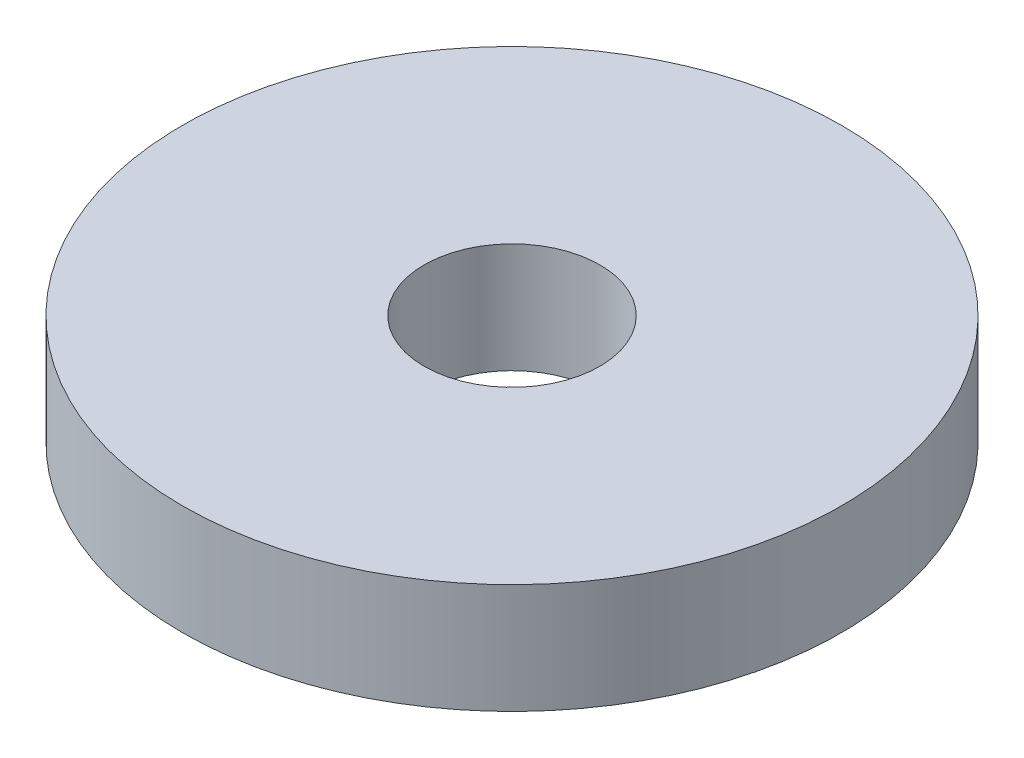
ISO-10303-21;
HEADER;
FILE_DESCRIPTION(('STEP AP214'),'2;1');
FILE_NAME('part.step','',(''),(''),'','','');
FILE_SCHEMA(('AUTOMOTIVE_DESIGN { 1 0 10303 214 1 1 1 1 }'));
ENDSEC;
DATA;
#1=APPLICATION_CONTEXT('core data for automotive mechanical design processes');
#2=APPLICATION_PROTOCOL_DEFINITION('international standard','automotive_design',2000,#1);
#3=PRODUCT_CONTEXT('',#1,'mechanical');
#4=PRODUCT('Part','Part','',(#3));
#5=PRODUCT_RELATED_PRODUCT_CATEGORY('part','',(#4));
#6=PRODUCT_DEFINITION_FORMATION('','',#4);
#7=PRODUCT_DEFINITION_CONTEXT('part definition',#1,'design');
#8=PRODUCT_DEFINITION('design','',#6,#7);
#9=PRODUCT_DEFINITION_SHAPE('','',#8);
#10=(LENGTH_UNIT() NAMED_UNIT(*) SI_UNIT(.MILLI.,.METRE.));
#11=(NAMED_UNIT(*) PLANE_ANGLE_UNIT() SI_UNIT($,.RADIAN.));
#12=(NAMED_UNIT(*) SI_UNIT($,.STERADIAN.) SOLID_ANGLE_UNIT());
#13=UNCERTAINTY_MEASURE_WITH_UNIT(LENGTH_MEASURE(1.E-05),#10,'distance_accuracy_value','');
#14=(GEOMETRIC_REPRESENTATION_CONTEXT(3) GLOBAL_UNCERTAINTY_ASSIGNED_CONTEXT((#13)) GLOBAL_UNIT_ASSIGNED_CONTEXT((#10,
#11,#12)) REPRESENTATION_CONTEXT('',''));
#15=CARTESIAN_POINT('',(0.,0.,0.));
#16=DIRECTION('',(0.,0.,1.));
#17=DIRECTION('',(1.,0.,0.));
#18=AXIS2_PLACEMENT_3D('',#15,#16,#17);
#19=CARTESIAN_POINT('',(0.,2.5,0.));
#20=DIRECTION('',(0.,1.,0.));
#21=DIRECTION('',(0.,0.,1.));
#22=AXIS2_PLACEMENT_3D('',#19,#20,#21);
#23=PLANE('',#22);
#24=CARTESIAN_POINT('',(0.,2.5,0.));
#25=DIRECTION('',(0.,1.,0.));
#26=DIRECTION('',(0.,0.,1.));
#27=AXIS2_PLACEMENT_3D('',#24,#25,#26);
#28=CIRCLE('',#27,15.);
#29=CARTESIAN_POINT('',(0.,2.5,15.));
#30=VERTEX_POINT('',#29);
#31=EDGE_CURVE('E10',#30,#30,#28,.T.);
#32=ORIENTED_EDGE('',*,*,#31,.T.);
#33=EDGE_LOOP('',(#32));
#34=FACE_BOUND('',#33,.T.);
#35=CARTESIAN_POINT('',(0.,2.5,0.));
#36=DIRECTION('',(0.,1.,0.));
#37=DIRECTION('',(0.,0.,1.));
#38=AXIS2_PLACEMENT_3D('',#35,#36,#37);
#39=CIRCLE('',#38,4.);
#40=CARTESIAN_POINT('',(0.,2.5,4.));
#41=VERTEX_POINT('',#40);
#42=EDGE_CURVE('E45',#41,#41,#39,.T.);
#43=ORIENTED_EDGE('',*,*,#42,.F.);
#44=EDGE_LOOP('',(#43));
#45=FACE_BOUND('',#44,.T.);
#46=ADVANCED_FACE('F34',(#34,#45),#23,.T.);
#47=CARTESIAN_POINT('',(0.,-2.5,0.));
#48=DIRECTION('',(0.,1.,0.));
#49=DIRECTION('',(0.,0.,1.));
#50=AXIS2_PLACEMENT_3D('',#47,#48,#49);
#51=PLANE('',#50);
#52=CARTESIAN_POINT('',(0.,-2.5,0.));
#53=DIRECTION('',(0.,1.,0.));
#54=DIRECTION('',(0.,0.,1.));
#55=AXIS2_PLACEMENT_3D('',#52,#53,#54);
#56=CIRCLE('',#55,15.);
#57=CARTESIAN_POINT('',(0.,-2.5,15.));
#58=VERTEX_POINT('',#57);
#59=EDGE_CURVE('E38',#58,#58,#56,.T.);
#60=ORIENTED_EDGE('',*,*,#59,.F.);
#61=EDGE_LOOP('',(#60));
#62=FACE_BOUND('',#61,.T.);
#63=CARTESIAN_POINT('',(0.,-2.5,0.));
#64=DIRECTION('',(0.,1.,0.));
#65=DIRECTION('',(0.,0.,1.));
#66=AXIS2_PLACEMENT_3D('',#63,#64,#65);
#67=CIRCLE('',#66,4.);
#68=CARTESIAN_POINT('',(0.,-2.5,4.));
#69=VERTEX_POINT('',#68);
#70=EDGE_CURVE('E47',#69,#69,#67,.T.);
#71=ORIENTED_EDGE('',*,*,#70,.T.);
#72=EDGE_LOOP('',(#71));
#73=FACE_BOUND('',#72,.T.);
#74=ADVANCED_FACE('F57',(#62,#73),#51,.F.);
#75=CARTESIAN_POINT('',(0.,2.5,0.));
#76=DIRECTION('',(0.,-1.,0.));
#77=DIRECTION('',(0.,0.,-1.));
#78=AXIS2_PLACEMENT_3D('',#75,#76,#77);
#79=CYLINDRICAL_SURFACE('',#78,15.);
#80=ORIENTED_EDGE('',*,*,#31,.F.);
#81=EDGE_LOOP('',(#80));
#82=FACE_BOUND('',#81,.T.);
#83=ORIENTED_EDGE('',*,*,#59,.T.);
#84=EDGE_LOOP('',(#83));
#85=FACE_BOUND('',#84,.T.);
#86=ADVANCED_FACE('F36',(#82,#85),#79,.T.);
#87=CARTESIAN_POINT('',(0.,2.5,0.));
#88=DIRECTION('',(0.,-1.,0.));
#89=DIRECTION('',(0.,0.,-1.));
#90=AXIS2_PLACEMENT_3D('',#87,#88,#89);
#91=CYLINDRICAL_SURFACE('',#90,4.);
#92=ORIENTED_EDGE('',*,*,#42,.T.);
#93=EDGE_LOOP('',(#92));
#94=FACE_BOUND('',#93,.T.);
#95=ORIENTED_EDGE('',*,*,#70,.F.);
#96=EDGE_LOOP('',(#95));
#97=FACE_BOUND('',#96,.T.);
#98=ADVANCED_FACE('F53',(#94,#97),#91,.F.);
#99=CLOSED_SHELL('',(#46,#74,#86,#98));
#100=MANIFOLD_SOLID_BREP('B2',#99);
#101=ADVANCED_BREP_SHAPE_REPRESENTATION('',(#18,#100),#14);
#102=SHAPE_DEFINITION_REPRESENTATION(#9,#101);
ENDSEC;
END-ISO-10303-21;
